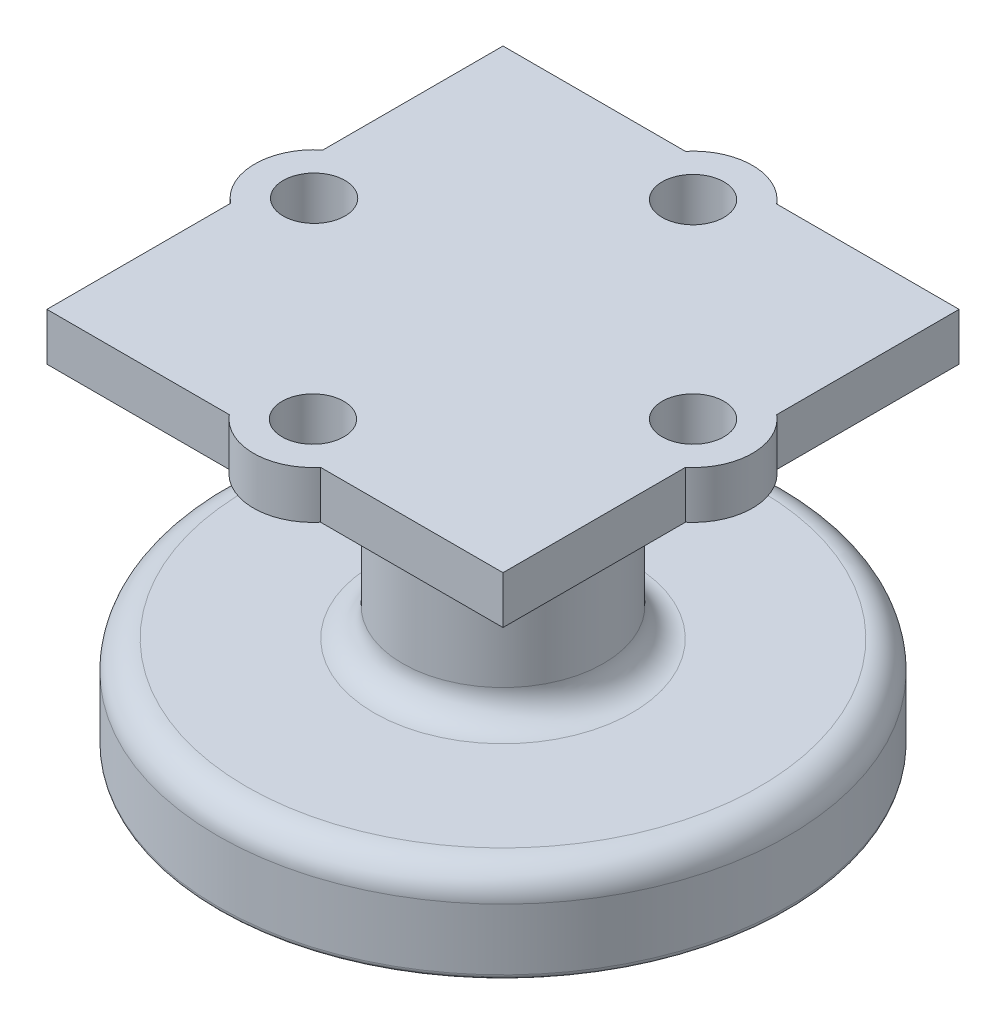
ISO-10303-21;
HEADER;
FILE_DESCRIPTION(('STEP AP214'),'2;1');
FILE_NAME('part.step','',(''),(''),'','','');
FILE_SCHEMA(('AUTOMOTIVE_DESIGN { 1 0 10303 214 1 1 1 1 }'));
ENDSEC;
DATA;
#1=APPLICATION_CONTEXT('core data for automotive mechanical design processes');
#2=APPLICATION_PROTOCOL_DEFINITION('international standard','automotive_design',2000,#1);
#3=PRODUCT_CONTEXT('',#1,'mechanical');
#4=PRODUCT('Part','Part','',(#3));
#5=PRODUCT_RELATED_PRODUCT_CATEGORY('part','',(#4));
#6=PRODUCT_DEFINITION_FORMATION('','',#4);
#7=PRODUCT_DEFINITION_CONTEXT('part definition',#1,'design');
#8=PRODUCT_DEFINITION('design','',#6,#7);
#9=PRODUCT_DEFINITION_SHAPE('','',#8);
#10=(LENGTH_UNIT() NAMED_UNIT(*) SI_UNIT(.MILLI.,.METRE.));
#11=(NAMED_UNIT(*) PLANE_ANGLE_UNIT() SI_UNIT($,.RADIAN.));
#12=(NAMED_UNIT(*) SI_UNIT($,.STERADIAN.) SOLID_ANGLE_UNIT());
#13=UNCERTAINTY_MEASURE_WITH_UNIT(LENGTH_MEASURE(1.E-05),#10,'distance_accuracy_value','');
#14=(GEOMETRIC_REPRESENTATION_CONTEXT(3) GLOBAL_UNCERTAINTY_ASSIGNED_CONTEXT((#13)) GLOBAL_UNIT_ASSIGNED_CONTEXT((#10,
#11,#12)) REPRESENTATION_CONTEXT('',''));
#15=CARTESIAN_POINT('',(0.,0.,0.));
#16=DIRECTION('',(0.,0.,1.));
#17=DIRECTION('',(1.,0.,0.));
#18=AXIS2_PLACEMENT_3D('',#15,#16,#17);
#19=CARTESIAN_POINT('',(20.,5.,0.));
#20=DIRECTION('',(0.,1.,0.));
#21=DIRECTION('',(0.,0.,1.));
#22=AXIS2_PLACEMENT_3D('',#19,#20,#21);
#23=PLANE('',#22);
#24=CARTESIAN_POINT('',(20.,5.,0.));
#25=DIRECTION('',(0.,1.,0.));
#26=DIRECTION('',(0.,0.,1.));
#27=AXIS2_PLACEMENT_3D('',#24,#25,#26);
#28=CIRCLE('',#27,3.25);
#29=CARTESIAN_POINT('',(20.,5.,3.25));
#30=VERTEX_POINT('',#29);
#31=EDGE_CURVE('E583',#30,#30,#28,.T.);
#32=ORIENTED_EDGE('',*,*,#31,.F.);
#33=EDGE_LOOP('',(#32));
#34=FACE_BOUND('',#33,.T.);
#35=CARTESIAN_POINT('',(0.,5.,-20.));
#36=DIRECTION('',(0.,1.,0.));
#37=DIRECTION('',(0.,0.,1.));
#38=AXIS2_PLACEMENT_3D('',#35,#36,#37);
#39=CIRCLE('',#38,3.25);
#40=CARTESIAN_POINT('',(0.,5.,-16.75));
#41=VERTEX_POINT('',#40);
#42=EDGE_CURVE('E389',#41,#41,#39,.T.);
#43=ORIENTED_EDGE('',*,*,#42,.F.);
#44=EDGE_LOOP('',(#43));
#45=FACE_BOUND('',#44,.T.);
#46=DIRECTION('',(1.,0.,0.));
#47=VECTOR('',#46,1.);
#48=CARTESIAN_POINT('',(4.80234317807463,5.,-24.));
#49=LINE('',#48,#47);
#50=CARTESIAN_POINT('',(4.80234317807463,5.,-24.));
#51=VERTEX_POINT('',#50);
#52=CARTESIAN_POINT('',(24.,5.,-24.));
#53=VERTEX_POINT('',#52);
#54=EDGE_CURVE('E414',#51,#53,#49,.T.);
#55=ORIENTED_EDGE('',*,*,#54,.F.);
#56=CARTESIAN_POINT('',(0.,5.,-20.));
#57=DIRECTION('',(0.,1.,0.));
#58=DIRECTION('',(0.,0.,1.));
#59=AXIS2_PLACEMENT_3D('',#56,#57,#58);
#60=CIRCLE('',#59,6.25);
#61=CARTESIAN_POINT('',(-4.80234317807463,5.,-24.));
#62=VERTEX_POINT('',#61);
#63=EDGE_CURVE('E380',#51,#62,#60,.T.);
#64=ORIENTED_EDGE('',*,*,#63,.T.);
#65=DIRECTION('',(1.,0.,0.));
#66=VECTOR('',#65,1.);
#67=CARTESIAN_POINT('',(-24.,5.,-24.));
#68=LINE('',#67,#66);
#69=CARTESIAN_POINT('',(-24.,5.,-24.));
#70=VERTEX_POINT('',#69);
#71=EDGE_CURVE('E363',#70,#62,#68,.T.);
#72=ORIENTED_EDGE('',*,*,#71,.F.);
#73=DIRECTION('',(0.,0.,1.));
#74=VECTOR('',#73,1.);
#75=CARTESIAN_POINT('',(-24.,5.,-24.));
#76=LINE('',#75,#74);
#77=CARTESIAN_POINT('',(-24.,5.,-5.04363246962454));
#78=VERTEX_POINT('',#77);
#79=EDGE_CURVE('E371',#70,#78,#76,.T.);
#80=ORIENTED_EDGE('',*,*,#79,.T.);
#81=CARTESIAN_POINT('',(-20.065667944918,5.,-0.187344660983607));
#82=DIRECTION('',(0.,1.,0.));
#83=DIRECTION('',(0.,0.,1.));
#84=AXIS2_PLACEMENT_3D('',#81,#82,#83);
#85=CIRCLE('',#84,6.25);
#86=CARTESIAN_POINT('',(-24.,5.,4.66894314765733));
#87=VERTEX_POINT('',#86);
#88=EDGE_CURVE('E376',#78,#87,#85,.T.);
#89=ORIENTED_EDGE('',*,*,#88,.T.);
#90=DIRECTION('',(0.,0.,1.));
#91=VECTOR('',#90,1.);
#92=CARTESIAN_POINT('',(-24.,5.,4.66894314765733));
#93=LINE('',#92,#91);
#94=CARTESIAN_POINT('',(-24.,5.,24.));
#95=VERTEX_POINT('',#94);
#96=EDGE_CURVE('E610',#87,#95,#93,.T.);
#97=ORIENTED_EDGE('',*,*,#96,.T.);
#98=DIRECTION('',(1.,0.,0.));
#99=VECTOR('',#98,1.);
#100=CARTESIAN_POINT('',(-24.,5.,24.));
#101=LINE('',#100,#99);
#102=CARTESIAN_POINT('',(-4.80234317807464,5.,24.));
#103=VERTEX_POINT('',#102);
#104=EDGE_CURVE('E608',#95,#103,#101,.T.);
#105=ORIENTED_EDGE('',*,*,#104,.T.);
#106=CARTESIAN_POINT('',(0.,5.,20.));
#107=DIRECTION('',(0.,1.,0.));
#108=DIRECTION('',(0.,0.,1.));
#109=AXIS2_PLACEMENT_3D('',#106,#107,#108);
#110=CIRCLE('',#109,6.25);
#111=CARTESIAN_POINT('',(4.80234317807464,5.,24.));
#112=VERTEX_POINT('',#111);
#113=EDGE_CURVE('E606',#103,#112,#110,.T.);
#114=ORIENTED_EDGE('',*,*,#113,.T.);
#115=DIRECTION('',(1.,0.,0.));
#116=VECTOR('',#115,1.);
#117=CARTESIAN_POINT('',(4.80234317807464,5.,24.));
#118=LINE('',#117,#116);
#119=CARTESIAN_POINT('',(24.,5.,24.));
#120=VERTEX_POINT('',#119);
#121=EDGE_CURVE('E604',#112,#120,#118,.T.);
#122=ORIENTED_EDGE('',*,*,#121,.T.);
#123=DIRECTION('',(0.,0.,1.));
#124=VECTOR('',#123,1.);
#125=CARTESIAN_POINT('',(24.,5.,4.80234317807463));
#126=LINE('',#125,#124);
#127=CARTESIAN_POINT('',(24.,5.,4.80234317807463));
#128=VERTEX_POINT('',#127);
#129=EDGE_CURVE('E601',#128,#120,#126,.T.);
#130=ORIENTED_EDGE('',*,*,#129,.F.);
#131=CARTESIAN_POINT('',(20.,5.,0.));
#132=DIRECTION('',(0.,1.,0.));
#133=DIRECTION('',(0.,0.,1.));
#134=AXIS2_PLACEMENT_3D('',#131,#132,#133);
#135=CIRCLE('',#134,6.25);
#136=CARTESIAN_POINT('',(24.,5.,-4.80234317807464));
#137=VERTEX_POINT('',#136);
#138=EDGE_CURVE('E599',#128,#137,#135,.T.);
#139=ORIENTED_EDGE('',*,*,#138,.T.);
#140=DIRECTION('',(0.,0.,1.));
#141=VECTOR('',#140,1.);
#142=CARTESIAN_POINT('',(24.,5.,-24.));
#143=LINE('',#142,#141);
#144=EDGE_CURVE('E597',#53,#137,#143,.T.);
#145=ORIENTED_EDGE('',*,*,#144,.F.);
#146=EDGE_LOOP('',(#55,#64,#72,#80,#89,#97,#105,#114,#122,#130,#139,#145));
#147=FACE_BOUND('',#146,.T.);
#148=CARTESIAN_POINT('',(0.,5.,20.));
#149=DIRECTION('',(0.,1.,0.));
#150=DIRECTION('',(0.,0.,1.));
#151=AXIS2_PLACEMENT_3D('',#148,#149,#150);
#152=CIRCLE('',#151,3.25);
#153=CARTESIAN_POINT('',(0.,5.,23.25));
#154=VERTEX_POINT('',#153);
#155=EDGE_CURVE('E578',#154,#154,#152,.T.);
#156=ORIENTED_EDGE('',*,*,#155,.F.);
#157=EDGE_LOOP('',(#156));
#158=FACE_BOUND('',#157,.T.);
#159=CARTESIAN_POINT('',(-20.065667944918,5.,-0.187344660983607));
#160=DIRECTION('',(0.,1.,0.));
#161=DIRECTION('',(0.,0.,1.));
#162=AXIS2_PLACEMENT_3D('',#159,#160,#161);
#163=CIRCLE('',#162,3.25);
#164=CARTESIAN_POINT('',(-20.065667944918,5.,3.06265533901639));
#165=VERTEX_POINT('',#164);
#166=EDGE_CURVE('E641',#165,#165,#163,.T.);
#167=ORIENTED_EDGE('',*,*,#166,.F.);
#168=EDGE_LOOP('',(#167));
#169=FACE_BOUND('',#168,.T.);
#170=ADVANCED_FACE('F263',(#34,#45,#147,#158,#169),#23,.T.);
#171=CARTESIAN_POINT('',(20.,0.,0.));
#172=DIRECTION('',(0.,1.,0.));
#173=DIRECTION('',(0.,0.,1.));
#174=AXIS2_PLACEMENT_3D('',#171,#172,#173);
#175=PLANE('',#174);
#176=CARTESIAN_POINT('',(0.,0.,0.));
#177=DIRECTION('',(0.,1.,0.));
#178=DIRECTION('',(0.,0.,1.));
#179=AXIS2_PLACEMENT_3D('',#176,#177,#178);
#180=CIRCLE('',#179,13.5671935359598);
#181=CARTESIAN_POINT('',(0.,0.,13.5671935359598));
#182=VERTEX_POINT('',#181);
#183=EDGE_CURVE('E440',#182,#182,#180,.T.);
#184=ORIENTED_EDGE('',*,*,#183,.T.);
#185=EDGE_LOOP('',(#184));
#186=FACE_BOUND('',#185,.T.);
#187=DIRECTION('',(1.,0.,0.));
#188=VECTOR('',#187,1.);
#189=CARTESIAN_POINT('',(4.80234317807463,0.,-24.));
#190=LINE('',#189,#188);
#191=CARTESIAN_POINT('',(4.80234317807463,0.,-24.));
#192=VERTEX_POINT('',#191);
#193=CARTESIAN_POINT('',(24.,0.,-24.));
#194=VERTEX_POINT('',#193);
#195=EDGE_CURVE('E385',#192,#194,#190,.T.);
#196=ORIENTED_EDGE('',*,*,#195,.T.);
#197=DIRECTION('',(0.,0.,1.));
#198=VECTOR('',#197,1.);
#199=CARTESIAN_POINT('',(24.,0.,-24.));
#200=LINE('',#199,#198);
#201=CARTESIAN_POINT('',(24.,0.,-4.80234317807464));
#202=VERTEX_POINT('',#201);
#203=EDGE_CURVE('E388',#194,#202,#200,.T.);
#204=ORIENTED_EDGE('',*,*,#203,.T.);
#205=CARTESIAN_POINT('',(20.,0.,0.));
#206=DIRECTION('',(0.,1.,0.));
#207=DIRECTION('',(0.,0.,1.));
#208=AXIS2_PLACEMENT_3D('',#205,#206,#207);
#209=CIRCLE('',#208,6.25);
#210=CARTESIAN_POINT('',(24.,0.,4.80234317807463));
#211=VERTEX_POINT('',#210);
#212=EDGE_CURVE('E392',#211,#202,#209,.T.);
#213=ORIENTED_EDGE('',*,*,#212,.F.);
#214=DIRECTION('',(0.,0.,1.));
#215=VECTOR('',#214,1.);
#216=CARTESIAN_POINT('',(24.,0.,4.80234317807463));
#217=LINE('',#216,#215);
#218=CARTESIAN_POINT('',(24.,0.,24.));
#219=VERTEX_POINT('',#218);
#220=EDGE_CURVE('E395',#211,#219,#217,.T.);
#221=ORIENTED_EDGE('',*,*,#220,.T.);
#222=DIRECTION('',(1.,0.,0.));
#223=VECTOR('',#222,1.);
#224=CARTESIAN_POINT('',(4.80234317807464,0.,24.));
#225=LINE('',#224,#223);
#226=CARTESIAN_POINT('',(4.80234317807464,0.,24.));
#227=VERTEX_POINT('',#226);
#228=EDGE_CURVE('E398',#227,#219,#225,.T.);
#229=ORIENTED_EDGE('',*,*,#228,.F.);
#230=CARTESIAN_POINT('',(0.,0.,20.));
#231=DIRECTION('',(0.,1.,0.));
#232=DIRECTION('',(0.,0.,1.));
#233=AXIS2_PLACEMENT_3D('',#230,#231,#232);
#234=CIRCLE('',#233,6.25);
#235=CARTESIAN_POINT('',(-4.80234317807464,0.,24.));
#236=VERTEX_POINT('',#235);
#237=EDGE_CURVE('E401',#236,#227,#234,.T.);
#238=ORIENTED_EDGE('',*,*,#237,.F.);
#239=DIRECTION('',(1.,0.,0.));
#240=VECTOR('',#239,1.);
#241=CARTESIAN_POINT('',(-24.,0.,24.));
#242=LINE('',#241,#240);
#243=CARTESIAN_POINT('',(-24.,0.,24.));
#244=VERTEX_POINT('',#243);
#245=EDGE_CURVE('E403',#244,#236,#242,.T.);
#246=ORIENTED_EDGE('',*,*,#245,.F.);
#247=DIRECTION('',(0.,0.,1.));
#248=VECTOR('',#247,1.);
#249=CARTESIAN_POINT('',(-24.,0.,4.66894314765733));
#250=LINE('',#249,#248);
#251=CARTESIAN_POINT('',(-24.,0.,4.66894314765733));
#252=VERTEX_POINT('',#251);
#253=EDGE_CURVE('E405',#252,#244,#250,.T.);
#254=ORIENTED_EDGE('',*,*,#253,.F.);
#255=CARTESIAN_POINT('',(-20.065667944918,0.,-0.187344660983607));
#256=DIRECTION('',(0.,1.,0.));
#257=DIRECTION('',(0.,0.,1.));
#258=AXIS2_PLACEMENT_3D('',#255,#256,#257);
#259=CIRCLE('',#258,6.25);
#260=CARTESIAN_POINT('',(-24.,0.,-5.04363246962454));
#261=VERTEX_POINT('',#260);
#262=EDGE_CURVE('E407',#261,#252,#259,.T.);
#263=ORIENTED_EDGE('',*,*,#262,.F.);
#264=DIRECTION('',(0.,0.,1.));
#265=VECTOR('',#264,1.);
#266=CARTESIAN_POINT('',(-24.,0.,-24.));
#267=LINE('',#266,#265);
#268=CARTESIAN_POINT('',(-24.,0.,-24.));
#269=VERTEX_POINT('',#268);
#270=EDGE_CURVE('E409',#269,#261,#267,.T.);
#271=ORIENTED_EDGE('',*,*,#270,.F.);
#272=DIRECTION('',(1.,0.,0.));
#273=VECTOR('',#272,1.);
#274=CARTESIAN_POINT('',(-24.,0.,-24.));
#275=LINE('',#274,#273);
#276=CARTESIAN_POINT('',(-4.80234317807463,0.,-24.));
#277=VERTEX_POINT('',#276);
#278=EDGE_CURVE('E365',#269,#277,#275,.T.);
#279=ORIENTED_EDGE('',*,*,#278,.T.);
#280=CARTESIAN_POINT('',(0.,0.,-20.));
#281=DIRECTION('',(0.,1.,0.));
#282=DIRECTION('',(0.,0.,1.));
#283=AXIS2_PLACEMENT_3D('',#280,#281,#282);
#284=CIRCLE('',#283,6.25);
#285=EDGE_CURVE('E412',#192,#277,#284,.T.);
#286=ORIENTED_EDGE('',*,*,#285,.F.);
#287=EDGE_LOOP('',(#196,#204,#213,#221,#229,#238,#246,#254,#263,#271,#279,#286));
#288=FACE_BOUND('',#287,.T.);
#289=CARTESIAN_POINT('',(0.,0.,-20.));
#290=DIRECTION('',(0.,1.,0.));
#291=DIRECTION('',(0.,0.,1.));
#292=AXIS2_PLACEMENT_3D('',#289,#290,#291);
#293=CIRCLE('',#292,3.25);
#294=CARTESIAN_POINT('',(0.,0.,-16.75));
#295=VERTEX_POINT('',#294);
#296=EDGE_CURVE('E585',#295,#295,#293,.T.);
#297=ORIENTED_EDGE('',*,*,#296,.T.);
#298=EDGE_LOOP('',(#297));
#299=FACE_BOUND('',#298,.T.);
#300=CARTESIAN_POINT('',(0.,0.,20.));
#301=DIRECTION('',(0.,1.,0.));
#302=DIRECTION('',(0.,0.,1.));
#303=AXIS2_PLACEMENT_3D('',#300,#301,#302);
#304=CIRCLE('',#303,3.25);
#305=CARTESIAN_POINT('',(0.,0.,23.25));
#306=VERTEX_POINT('',#305);
#307=EDGE_CURVE('E581',#306,#306,#304,.T.);
#308=ORIENTED_EDGE('',*,*,#307,.T.);
#309=EDGE_LOOP('',(#308));
#310=FACE_BOUND('',#309,.T.);
#311=CARTESIAN_POINT('',(20.,0.,0.));
#312=DIRECTION('',(0.,1.,0.));
#313=DIRECTION('',(0.,0.,1.));
#314=AXIS2_PLACEMENT_3D('',#311,#312,#313);
#315=CIRCLE('',#314,3.25);
#316=CARTESIAN_POINT('',(20.,0.,3.25));
#317=VERTEX_POINT('',#316);
#318=EDGE_CURVE('E588',#317,#317,#315,.T.);
#319=ORIENTED_EDGE('',*,*,#318,.T.);
#320=EDGE_LOOP('',(#319));
#321=FACE_BOUND('',#320,.T.);
#322=CARTESIAN_POINT('',(-20.065667944918,0.,-0.187344660983607));
#323=DIRECTION('',(0.,1.,0.));
#324=DIRECTION('',(0.,0.,1.));
#325=AXIS2_PLACEMENT_3D('',#322,#323,#324);
#326=CIRCLE('',#325,3.25);
#327=CARTESIAN_POINT('',(-20.065667944918,0.,3.06265533901639));
#328=VERTEX_POINT('',#327);
#329=EDGE_CURVE('E639',#328,#328,#326,.T.);
#330=ORIENTED_EDGE('',*,*,#329,.T.);
#331=EDGE_LOOP('',(#330));
#332=FACE_BOUND('',#331,.T.);
#333=ADVANCED_FACE('F494',(#186,#288,#299,#310,#321,#332),#175,.F.);
#334=CARTESIAN_POINT('',(4.80234317807463,5.,-24.));
#335=DIRECTION('',(0.,0.,-1.));
#336=DIRECTION('',(-1.,0.,0.));
#337=AXIS2_PLACEMENT_3D('',#334,#335,#336);
#338=PLANE('',#337);
#339=ORIENTED_EDGE('',*,*,#195,.F.);
#340=DIRECTION('',(0.,-1.,0.));
#341=VECTOR('',#340,1.);
#342=CARTESIAN_POINT('',(4.80234317807463,5.,-24.));
#343=LINE('',#342,#341);
#344=EDGE_CURVE('E280',#51,#192,#343,.T.);
#345=ORIENTED_EDGE('',*,*,#344,.F.);
#346=ORIENTED_EDGE('',*,*,#54,.T.);
#347=DIRECTION('',(0.,-1.,0.));
#348=VECTOR('',#347,1.);
#349=CARTESIAN_POINT('',(24.,5.,-24.));
#350=LINE('',#349,#348);
#351=EDGE_CURVE('E333',#53,#194,#350,.T.);
#352=ORIENTED_EDGE('',*,*,#351,.T.);
#353=EDGE_LOOP('',(#339,#345,#346,#352));
#354=FACE_BOUND('',#353,.T.);
#355=ADVANCED_FACE('F500',(#354),#338,.T.);
#356=CARTESIAN_POINT('',(0.,5.,-20.));
#357=DIRECTION('',(0.,-1.,0.));
#358=DIRECTION('',(0.,0.,-1.));
#359=AXIS2_PLACEMENT_3D('',#356,#357,#358);
#360=CYLINDRICAL_SURFACE('',#359,6.25);
#361=ORIENTED_EDGE('',*,*,#285,.T.);
#362=DIRECTION('',(0.,-1.,0.));
#363=VECTOR('',#362,1.);
#364=CARTESIAN_POINT('',(-4.80234317807463,5.,-24.));
#365=LINE('',#364,#363);
#366=EDGE_CURVE('E322',#62,#277,#365,.T.);
#367=ORIENTED_EDGE('',*,*,#366,.F.);
#368=ORIENTED_EDGE('',*,*,#63,.F.);
#369=ORIENTED_EDGE('',*,*,#344,.T.);
#370=EDGE_LOOP('',(#361,#367,#368,#369));
#371=FACE_BOUND('',#370,.T.);
#372=ADVANCED_FACE('F509',(#371),#360,.T.);
#373=CARTESIAN_POINT('',(-24.,5.,-24.));
#374=DIRECTION('',(0.,0.,-1.));
#375=DIRECTION('',(-1.,0.,0.));
#376=AXIS2_PLACEMENT_3D('',#373,#374,#375);
#377=PLANE('',#376);
#378=ORIENTED_EDGE('',*,*,#278,.F.);
#379=DIRECTION('',(0.,-1.,0.));
#380=VECTOR('',#379,1.);
#381=CARTESIAN_POINT('',(-24.,5.,-24.));
#382=LINE('',#381,#380);
#383=EDGE_CURVE('E359',#70,#269,#382,.T.);
#384=ORIENTED_EDGE('',*,*,#383,.F.);
#385=ORIENTED_EDGE('',*,*,#71,.T.);
#386=ORIENTED_EDGE('',*,*,#366,.T.);
#387=EDGE_LOOP('',(#378,#384,#385,#386));
#388=FACE_BOUND('',#387,.T.);
#389=ADVANCED_FACE('F361',(#388),#377,.T.);
#390=CARTESIAN_POINT('',(-24.,5.,-24.));
#391=DIRECTION('',(1.,0.,0.));
#392=DIRECTION('',(0.,0.,-1.));
#393=AXIS2_PLACEMENT_3D('',#390,#391,#392);
#394=PLANE('',#393);
#395=ORIENTED_EDGE('',*,*,#270,.T.);
#396=DIRECTION('',(0.,-1.,0.));
#397=VECTOR('',#396,1.);
#398=CARTESIAN_POINT('',(-24.,5.,-5.04363246962454));
#399=LINE('',#398,#397);
#400=EDGE_CURVE('E368',#78,#261,#399,.T.);
#401=ORIENTED_EDGE('',*,*,#400,.F.);
#402=ORIENTED_EDGE('',*,*,#79,.F.);
#403=ORIENTED_EDGE('',*,*,#383,.T.);
#404=EDGE_LOOP('',(#395,#401,#402,#403));
#405=FACE_BOUND('',#404,.T.);
#406=ADVANCED_FACE('F372',(#405),#394,.F.);
#407=CARTESIAN_POINT('',(-20.065667944918,5.,-0.187344660983607));
#408=DIRECTION('',(0.,-1.,0.));
#409=DIRECTION('',(0.,0.,-1.));
#410=AXIS2_PLACEMENT_3D('',#407,#408,#409);
#411=CYLINDRICAL_SURFACE('',#410,6.25);
#412=ORIENTED_EDGE('',*,*,#262,.T.);
#413=DIRECTION('',(0.,-1.,0.));
#414=VECTOR('',#413,1.);
#415=CARTESIAN_POINT('',(-24.,5.,4.66894314765733));
#416=LINE('',#415,#414);
#417=EDGE_CURVE('E419',#87,#252,#416,.T.);
#418=ORIENTED_EDGE('',*,*,#417,.F.);
#419=ORIENTED_EDGE('',*,*,#88,.F.);
#420=ORIENTED_EDGE('',*,*,#400,.T.);
#421=EDGE_LOOP('',(#412,#418,#419,#420));
#422=FACE_BOUND('',#421,.T.);
#423=ADVANCED_FACE('F516',(#422),#411,.T.);
#424=CARTESIAN_POINT('',(-24.,5.,4.66894314765733));
#425=DIRECTION('',(1.,0.,0.));
#426=DIRECTION('',(0.,0.,-1.));
#427=AXIS2_PLACEMENT_3D('',#424,#425,#426);
#428=PLANE('',#427);
#429=ORIENTED_EDGE('',*,*,#253,.T.);
#430=DIRECTION('',(0.,-1.,0.));
#431=VECTOR('',#430,1.);
#432=CARTESIAN_POINT('',(-24.,5.,24.));
#433=LINE('',#432,#431);
#434=EDGE_CURVE('E422',#95,#244,#433,.T.);
#435=ORIENTED_EDGE('',*,*,#434,.F.);
#436=ORIENTED_EDGE('',*,*,#96,.F.);
#437=ORIENTED_EDGE('',*,*,#417,.T.);
#438=EDGE_LOOP('',(#429,#435,#436,#437));
#439=FACE_BOUND('',#438,.T.);
#440=ADVANCED_FACE('F519',(#439),#428,.F.);
#441=CARTESIAN_POINT('',(-24.,5.,24.));
#442=DIRECTION('',(0.,0.,-1.));
#443=DIRECTION('',(-1.,0.,0.));
#444=AXIS2_PLACEMENT_3D('',#441,#442,#443);
#445=PLANE('',#444);
#446=ORIENTED_EDGE('',*,*,#245,.T.);
#447=DIRECTION('',(0.,-1.,0.));
#448=VECTOR('',#447,1.);
#449=CARTESIAN_POINT('',(-4.80234317807464,5.,24.));
#450=LINE('',#449,#448);
#451=EDGE_CURVE('E425',#103,#236,#450,.T.);
#452=ORIENTED_EDGE('',*,*,#451,.F.);
#453=ORIENTED_EDGE('',*,*,#104,.F.);
#454=ORIENTED_EDGE('',*,*,#434,.T.);
#455=EDGE_LOOP('',(#446,#452,#453,#454));
#456=FACE_BOUND('',#455,.T.);
#457=ADVANCED_FACE('F523',(#456),#445,.F.);
#458=CARTESIAN_POINT('',(0.,5.,20.));
#459=DIRECTION('',(0.,-1.,0.));
#460=DIRECTION('',(0.,0.,-1.));
#461=AXIS2_PLACEMENT_3D('',#458,#459,#460);
#462=CYLINDRICAL_SURFACE('',#461,6.25);
#463=ORIENTED_EDGE('',*,*,#237,.T.);
#464=DIRECTION('',(0.,-1.,0.));
#465=VECTOR('',#464,1.);
#466=CARTESIAN_POINT('',(4.80234317807464,5.,24.));
#467=LINE('',#466,#465);
#468=EDGE_CURVE('E428',#112,#227,#467,.T.);
#469=ORIENTED_EDGE('',*,*,#468,.F.);
#470=ORIENTED_EDGE('',*,*,#113,.F.);
#471=ORIENTED_EDGE('',*,*,#451,.T.);
#472=EDGE_LOOP('',(#463,#469,#470,#471));
#473=FACE_BOUND('',#472,.T.);
#474=ADVANCED_FACE('F527',(#473),#462,.T.);
#475=CARTESIAN_POINT('',(4.80234317807464,5.,24.));
#476=DIRECTION('',(0.,0.,-1.));
#477=DIRECTION('',(-1.,0.,0.));
#478=AXIS2_PLACEMENT_3D('',#475,#476,#477);
#479=PLANE('',#478);
#480=ORIENTED_EDGE('',*,*,#228,.T.);
#481=DIRECTION('',(0.,-1.,0.));
#482=VECTOR('',#481,1.);
#483=CARTESIAN_POINT('',(24.,5.,24.));
#484=LINE('',#483,#482);
#485=EDGE_CURVE('E431',#120,#219,#484,.T.);
#486=ORIENTED_EDGE('',*,*,#485,.F.);
#487=ORIENTED_EDGE('',*,*,#121,.F.);
#488=ORIENTED_EDGE('',*,*,#468,.T.);
#489=EDGE_LOOP('',(#480,#486,#487,#488));
#490=FACE_BOUND('',#489,.T.);
#491=ADVANCED_FACE('F531',(#490),#479,.F.);
#492=CARTESIAN_POINT('',(24.,5.,4.80234317807463));
#493=DIRECTION('',(1.,0.,0.));
#494=DIRECTION('',(0.,0.,-1.));
#495=AXIS2_PLACEMENT_3D('',#492,#493,#494);
#496=PLANE('',#495);
#497=ORIENTED_EDGE('',*,*,#220,.F.);
#498=DIRECTION('',(0.,-1.,0.));
#499=VECTOR('',#498,1.);
#500=CARTESIAN_POINT('',(24.,5.,4.80234317807463));
#501=LINE('',#500,#499);
#502=EDGE_CURVE('E433',#128,#211,#501,.T.);
#503=ORIENTED_EDGE('',*,*,#502,.F.);
#504=ORIENTED_EDGE('',*,*,#129,.T.);
#505=ORIENTED_EDGE('',*,*,#485,.T.);
#506=EDGE_LOOP('',(#497,#503,#504,#505));
#507=FACE_BOUND('',#506,.T.);
#508=ADVANCED_FACE('F535',(#507),#496,.T.);
#509=CARTESIAN_POINT('',(20.,5.,0.));
#510=DIRECTION('',(0.,-1.,0.));
#511=DIRECTION('',(0.,0.,-1.));
#512=AXIS2_PLACEMENT_3D('',#509,#510,#511);
#513=CYLINDRICAL_SURFACE('',#512,6.25);
#514=ORIENTED_EDGE('',*,*,#212,.T.);
#515=DIRECTION('',(0.,-1.,0.));
#516=VECTOR('',#515,1.);
#517=CARTESIAN_POINT('',(24.,5.,-4.80234317807464));
#518=LINE('',#517,#516);
#519=EDGE_CURVE('E435',#137,#202,#518,.T.);
#520=ORIENTED_EDGE('',*,*,#519,.F.);
#521=ORIENTED_EDGE('',*,*,#138,.F.);
#522=ORIENTED_EDGE('',*,*,#502,.T.);
#523=EDGE_LOOP('',(#514,#520,#521,#522));
#524=FACE_BOUND('',#523,.T.);
#525=ADVANCED_FACE('F539',(#524),#513,.T.);
#526=CARTESIAN_POINT('',(24.,5.,-24.));
#527=DIRECTION('',(1.,0.,0.));
#528=DIRECTION('',(0.,0.,-1.));
#529=AXIS2_PLACEMENT_3D('',#526,#527,#528);
#530=PLANE('',#529);
#531=ORIENTED_EDGE('',*,*,#203,.F.);
#532=ORIENTED_EDGE('',*,*,#351,.F.);
#533=ORIENTED_EDGE('',*,*,#144,.T.);
#534=ORIENTED_EDGE('',*,*,#519,.T.);
#535=EDGE_LOOP('',(#531,#532,#533,#534));
#536=FACE_BOUND('',#535,.T.);
#537=ADVANCED_FACE('F543',(#536),#530,.T.);
#538=CARTESIAN_POINT('',(0.,5.,-20.));
#539=DIRECTION('',(0.,-1.,0.));
#540=DIRECTION('',(0.,0.,-1.));
#541=AXIS2_PLACEMENT_3D('',#538,#539,#540);
#542=CYLINDRICAL_SURFACE('',#541,3.25);
#543=ORIENTED_EDGE('',*,*,#42,.T.);
#544=EDGE_LOOP('',(#543));
#545=FACE_BOUND('',#544,.T.);
#546=ORIENTED_EDGE('',*,*,#296,.F.);
#547=EDGE_LOOP('',(#546));
#548=FACE_BOUND('',#547,.T.);
#549=ADVANCED_FACE('F506',(#545,#548),#542,.F.);
#550=CARTESIAN_POINT('',(0.,5.,20.));
#551=DIRECTION('',(0.,-1.,0.));
#552=DIRECTION('',(0.,0.,-1.));
#553=AXIS2_PLACEMENT_3D('',#550,#551,#552);
#554=CYLINDRICAL_SURFACE('',#553,3.25);
#555=ORIENTED_EDGE('',*,*,#155,.T.);
#556=EDGE_LOOP('',(#555));
#557=FACE_BOUND('',#556,.T.);
#558=ORIENTED_EDGE('',*,*,#307,.F.);
#559=EDGE_LOOP('',(#558));
#560=FACE_BOUND('',#559,.T.);
#561=ADVANCED_FACE('F567',(#557,#560),#554,.F.);
#562=CARTESIAN_POINT('',(20.,5.,0.));
#563=DIRECTION('',(0.,-1.,0.));
#564=DIRECTION('',(0.,0.,-1.));
#565=AXIS2_PLACEMENT_3D('',#562,#563,#564);
#566=CYLINDRICAL_SURFACE('',#565,3.25);
#567=ORIENTED_EDGE('',*,*,#31,.T.);
#568=EDGE_LOOP('',(#567));
#569=FACE_BOUND('',#568,.T.);
#570=ORIENTED_EDGE('',*,*,#318,.F.);
#571=EDGE_LOOP('',(#570));
#572=FACE_BOUND('',#571,.T.);
#573=ADVANCED_FACE('F562',(#569,#572),#566,.F.);
#574=CARTESIAN_POINT('',(-20.065667944918,5.,-0.187344660983607));
#575=DIRECTION('',(0.,-1.,0.));
#576=DIRECTION('',(0.,0.,-1.));
#577=AXIS2_PLACEMENT_3D('',#574,#575,#576);
#578=CYLINDRICAL_SURFACE('',#577,3.25);
#579=ORIENTED_EDGE('',*,*,#166,.T.);
#580=EDGE_LOOP('',(#579));
#581=FACE_BOUND('',#580,.T.);
#582=ORIENTED_EDGE('',*,*,#329,.F.);
#583=EDGE_LOOP('',(#582));
#584=FACE_BOUND('',#583,.T.);
#585=ADVANCED_FACE('F557',(#581,#584),#578,.F.);
#586=CARTESIAN_POINT('',(0.,-25.,0.));
#587=DIRECTION('',(0.,1.,0.));
#588=DIRECTION('',(0.,0.,1.));
#589=AXIS2_PLACEMENT_3D('',#586,#587,#588);
#590=CYLINDRICAL_SURFACE('',#589,10.5671935359598);
#591=CARTESIAN_POINT('',(0.,-22.,0.));
#592=DIRECTION('',(0.,-1.,0.));
#593=DIRECTION('',(0.,0.,-1.));
#594=AXIS2_PLACEMENT_3D('',#591,#592,#593);
#595=CIRCLE('',#594,10.5671935359598);
#596=CARTESIAN_POINT('',(0.,-22.,-10.5671935359598));
#597=VERTEX_POINT('',#596);
#598=EDGE_CURVE('E272',#597,#597,#595,.F.);
#599=ORIENTED_EDGE('',*,*,#598,.T.);
#600=EDGE_LOOP('',(#599));
#601=FACE_BOUND('',#600,.T.);
#602=CARTESIAN_POINT('',(0.,-3.,0.));
#603=DIRECTION('',(0.,1.,0.));
#604=DIRECTION('',(0.,0.,1.));
#605=AXIS2_PLACEMENT_3D('',#602,#603,#604);
#606=CIRCLE('',#605,10.5671935359598);
#607=CARTESIAN_POINT('',(0.,-3.,10.5671935359598));
#608=VERTEX_POINT('',#607);
#609=EDGE_CURVE('E416',#608,#608,#606,.F.);
#610=ORIENTED_EDGE('',*,*,#609,.T.);
#611=EDGE_LOOP('',(#610));
#612=FACE_BOUND('',#611,.T.);
#613=ADVANCED_FACE('F457',(#601,#612),#590,.T.);
#614=CARTESIAN_POINT('',(0.,-35.,0.));
#615=DIRECTION('',(0.,1.,0.));
#616=DIRECTION('',(0.,0.,1.));
#617=AXIS2_PLACEMENT_3D('',#614,#615,#616);
#618=CYLINDRICAL_SURFACE('',#617,30.);
#619=CARTESIAN_POINT('',(0.,-28.,0.));
#620=DIRECTION('',(0.,-1.,0.));
#621=DIRECTION('',(0.,0.,-1.));
#622=AXIS2_PLACEMENT_3D('',#619,#620,#621);
#623=CIRCLE('',#622,30.);
#624=CARTESIAN_POINT('',(0.,-28.,-30.));
#625=VERTEX_POINT('',#624);
#626=EDGE_CURVE('E12',#625,#625,#623,.T.);
#627=ORIENTED_EDGE('',*,*,#626,.T.);
#628=EDGE_LOOP('',(#627));
#629=FACE_BOUND('',#628,.T.);
#630=CARTESIAN_POINT('',(0.,-34.44,0.));
#631=DIRECTION('',(0.,-1.,0.));
#632=DIRECTION('',(0.,0.,-1.));
#633=AXIS2_PLACEMENT_3D('',#630,#631,#632);
#634=CIRCLE('',#633,30.);
#635=CARTESIAN_POINT('',(0.,-34.44,-30.));
#636=VERTEX_POINT('',#635);
#637=EDGE_CURVE('E446',#636,#636,#634,.F.);
#638=ORIENTED_EDGE('',*,*,#637,.T.);
#639=EDGE_LOOP('',(#638));
#640=FACE_BOUND('',#639,.T.);
#641=ADVANCED_FACE('F478',(#629,#640),#618,.T.);
#642=CARTESIAN_POINT('',(0.,-35.,0.));
#643=DIRECTION('',(0.,-1.,0.));
#644=DIRECTION('',(0.,0.,-1.));
#645=AXIS2_PLACEMENT_3D('',#642,#643,#644);
#646=PLANE('',#645);
#647=CARTESIAN_POINT('',(0.,-35.,0.));
#648=DIRECTION('',(0.,-1.,0.));
#649=DIRECTION('',(0.,0.,-1.));
#650=AXIS2_PLACEMENT_3D('',#647,#648,#649);
#651=CIRCLE('',#650,29.44);
#652=CARTESIAN_POINT('',(0.,-35.,-29.44));
#653=VERTEX_POINT('',#652);
#654=EDGE_CURVE('E443',#653,#653,#651,.T.);
#655=ORIENTED_EDGE('',*,*,#654,.T.);
#656=EDGE_LOOP('',(#655));
#657=FACE_BOUND('',#656,.T.);
#658=ADVANCED_FACE('F470',(#657),#646,.T.);
#659=CARTESIAN_POINT('',(0.,-25.,0.));
#660=DIRECTION('',(0.,-1.,0.));
#661=DIRECTION('',(0.,0.,-1.));
#662=AXIS2_PLACEMENT_3D('',#659,#660,#661);
#663=PLANE('',#662);
#664=CARTESIAN_POINT('',(0.,-25.,0.));
#665=DIRECTION('',(0.,-1.,0.));
#666=DIRECTION('',(0.,0.,-1.));
#667=AXIS2_PLACEMENT_3D('',#664,#665,#666);
#668=CIRCLE('',#667,13.5671935359598);
#669=CARTESIAN_POINT('',(0.,-25.,-13.5671935359598));
#670=VERTEX_POINT('',#669);
#671=EDGE_CURVE('E452',#670,#670,#668,.T.);
#672=ORIENTED_EDGE('',*,*,#671,.T.);
#673=EDGE_LOOP('',(#672));
#674=FACE_BOUND('',#673,.T.);
#675=CARTESIAN_POINT('',(0.,-25.,0.));
#676=DIRECTION('',(0.,-1.,0.));
#677=DIRECTION('',(0.,0.,-1.));
#678=AXIS2_PLACEMENT_3D('',#675,#676,#677);
#679=CIRCLE('',#678,27.);
#680=CARTESIAN_POINT('',(0.,-25.,-27.));
#681=VERTEX_POINT('',#680);
#682=EDGE_CURVE('E449',#681,#681,#679,.F.);
#683=ORIENTED_EDGE('',*,*,#682,.T.);
#684=EDGE_LOOP('',(#683));
#685=FACE_BOUND('',#684,.T.);
#686=ADVANCED_FACE('F466',(#674,#685),#663,.F.);
#687=CARTESIAN_POINT('',(0.,-3.,0.));
#688=DIRECTION('',(0.,1.,0.));
#689=DIRECTION('',(0.,0.,1.));
#690=AXIS2_PLACEMENT_3D('',#687,#688,#689);
#691=TOROIDAL_SURFACE('',#690,13.5671935359598,3.);
#692=ORIENTED_EDGE('',*,*,#183,.F.);
#693=EDGE_LOOP('',(#692));
#694=FACE_BOUND('',#693,.T.);
#695=ORIENTED_EDGE('',*,*,#609,.F.);
#696=EDGE_LOOP('',(#695));
#697=FACE_BOUND('',#696,.T.);
#698=ADVANCED_FACE('F469',(#694,#697),#691,.F.);
#699=CARTESIAN_POINT('',(0.,-34.44,0.));
#700=DIRECTION('',(0.,-1.,0.));
#701=DIRECTION('',(0.,0.,-1.));
#702=AXIS2_PLACEMENT_3D('',#699,#700,#701);
#703=TOROIDAL_SURFACE('',#702,29.44,0.56);
#704=ORIENTED_EDGE('',*,*,#637,.F.);
#705=EDGE_LOOP('',(#704));
#706=FACE_BOUND('',#705,.T.);
#707=ORIENTED_EDGE('',*,*,#654,.F.);
#708=EDGE_LOOP('',(#707));
#709=FACE_BOUND('',#708,.T.);
#710=ADVANCED_FACE('F463',(#706,#709),#703,.T.);
#711=CARTESIAN_POINT('',(0.,-22.,0.));
#712=DIRECTION('',(0.,-1.,0.));
#713=DIRECTION('',(0.,0.,-1.));
#714=AXIS2_PLACEMENT_3D('',#711,#712,#713);
#715=TOROIDAL_SURFACE('',#714,13.5671935359598,3.);
#716=ORIENTED_EDGE('',*,*,#598,.F.);
#717=EDGE_LOOP('',(#716));
#718=FACE_BOUND('',#717,.T.);
#719=ORIENTED_EDGE('',*,*,#671,.F.);
#720=EDGE_LOOP('',(#719));
#721=FACE_BOUND('',#720,.T.);
#722=ADVANCED_FACE('F460',(#718,#721),#715,.F.);
#723=CARTESIAN_POINT('',(0.,-28.,0.));
#724=DIRECTION('',(0.,-1.,0.));
#725=DIRECTION('',(0.,0.,-1.));
#726=AXIS2_PLACEMENT_3D('',#723,#724,#725);
#727=TOROIDAL_SURFACE('',#726,27.,3.);
#728=ORIENTED_EDGE('',*,*,#682,.F.);
#729=EDGE_LOOP('',(#728));
#730=FACE_BOUND('',#729,.T.);
#731=ORIENTED_EDGE('',*,*,#626,.F.);
#732=EDGE_LOOP('',(#731));
#733=FACE_BOUND('',#732,.T.);
#734=ADVANCED_FACE('F265',(#730,#733),#727,.T.);
#735=CLOSED_SHELL('',(#170,#333,#355,#372,#389,#406,#423,#440,#457,#474,#491,#508,#525,#537,
#549,#561,#573,#585,#613,#641,#658,#686,#698,#710,#722,#734));
#736=MANIFOLD_SOLID_BREP('B2',#735);
#737=ADVANCED_BREP_SHAPE_REPRESENTATION('',(#18,#736),#14);
#738=SHAPE_DEFINITION_REPRESENTATION(#9,#737);
ENDSEC;
END-ISO-10303-21;
